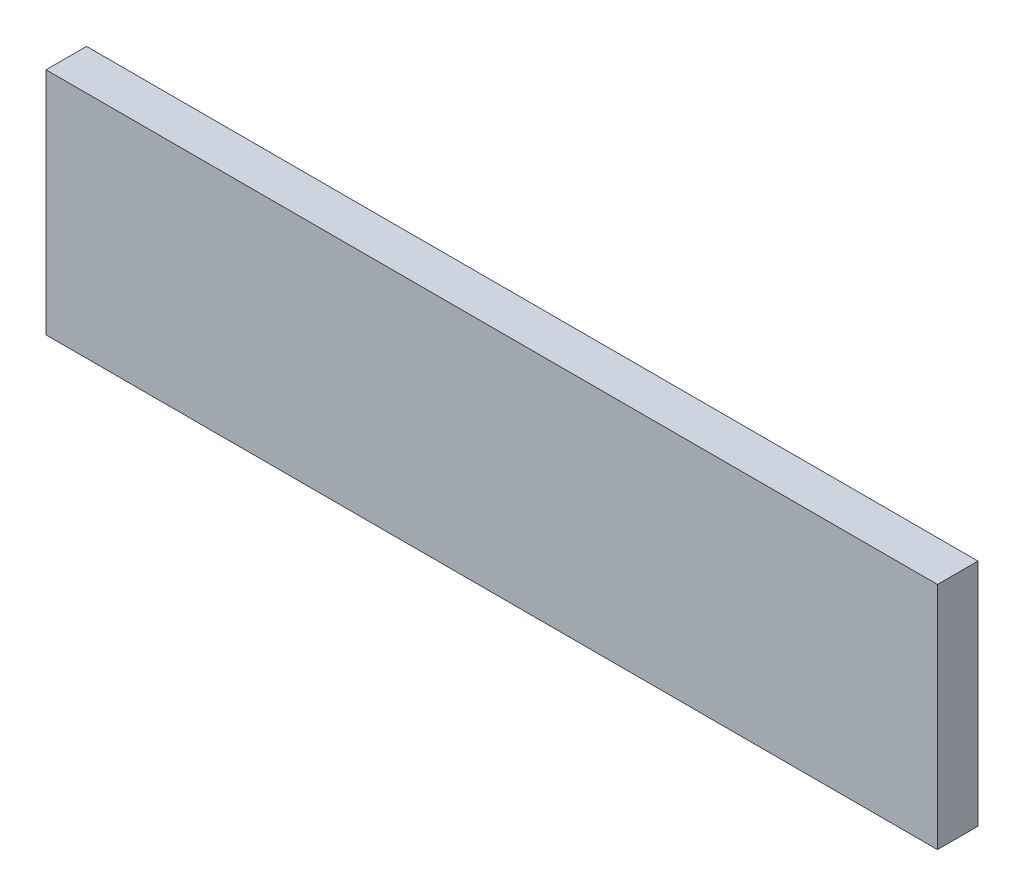
ISO-10303-21;
HEADER;
FILE_DESCRIPTION(('STEP AP214'),'2;1');
FILE_NAME('part.step','',(''),(''),'','','');
FILE_SCHEMA(('AUTOMOTIVE_DESIGN { 1 0 10303 214 1 1 1 1 }'));
ENDSEC;
DATA;
#1=APPLICATION_CONTEXT('core data for automotive mechanical design processes');
#2=APPLICATION_PROTOCOL_DEFINITION('international standard','automotive_design',2000,#1);
#3=PRODUCT_CONTEXT('',#1,'mechanical');
#4=PRODUCT('Part','Part','',(#3));
#5=PRODUCT_RELATED_PRODUCT_CATEGORY('part','',(#4));
#6=PRODUCT_DEFINITION_FORMATION('','',#4);
#7=PRODUCT_DEFINITION_CONTEXT('part definition',#1,'design');
#8=PRODUCT_DEFINITION('design','',#6,#7);
#9=PRODUCT_DEFINITION_SHAPE('','',#8);
#10=(LENGTH_UNIT() NAMED_UNIT(*) SI_UNIT(.MILLI.,.METRE.));
#11=(NAMED_UNIT(*) PLANE_ANGLE_UNIT() SI_UNIT($,.RADIAN.));
#12=(NAMED_UNIT(*) SI_UNIT($,.STERADIAN.) SOLID_ANGLE_UNIT());
#13=UNCERTAINTY_MEASURE_WITH_UNIT(LENGTH_MEASURE(1.E-05),#10,'distance_accuracy_value','');
#14=(GEOMETRIC_REPRESENTATION_CONTEXT(3) GLOBAL_UNCERTAINTY_ASSIGNED_CONTEXT((#13)) GLOBAL_UNIT_ASSIGNED_CONTEXT((#10,
#11,#12)) REPRESENTATION_CONTEXT('',''));
#15=CARTESIAN_POINT('',(0.,0.,0.));
#16=DIRECTION('',(0.,0.,1.));
#17=DIRECTION('',(1.,0.,0.));
#18=AXIS2_PLACEMENT_3D('',#15,#16,#17);
#19=CARTESIAN_POINT('',(165.,42.5,15.));
#20=DIRECTION('',(-1.,0.,0.));
#21=DIRECTION('',(0.,-1.,0.));
#22=AXIS2_PLACEMENT_3D('',#19,#20,#21);
#23=PLANE('',#22);
#24=DIRECTION('',(0.,1.,0.));
#25=VECTOR('',#24,1.);
#26=CARTESIAN_POINT('',(165.,42.5,0.));
#27=LINE('',#26,#25);
#28=CARTESIAN_POINT('',(165.,-42.5,0.));
#29=VERTEX_POINT('',#28);
#30=CARTESIAN_POINT('',(165.,42.5,0.));
#31=VERTEX_POINT('',#30);
#32=EDGE_CURVE('E99',#29,#31,#27,.T.);
#33=ORIENTED_EDGE('',*,*,#32,.T.);
#34=DIRECTION('',(0.,0.,-1.));
#35=VECTOR('',#34,1.);
#36=CARTESIAN_POINT('',(165.,42.5,15.));
#37=LINE('',#36,#35);
#38=CARTESIAN_POINT('',(165.,42.5,15.));
#39=VERTEX_POINT('',#38);
#40=EDGE_CURVE('E11',#39,#31,#37,.T.);
#41=ORIENTED_EDGE('',*,*,#40,.F.);
#42=DIRECTION('',(0.,1.,0.));
#43=VECTOR('',#42,1.);
#44=CARTESIAN_POINT('',(165.,42.5,15.));
#45=LINE('',#44,#43);
#46=CARTESIAN_POINT('',(165.,-42.5,15.));
#47=VERTEX_POINT('',#46);
#48=EDGE_CURVE('E87',#47,#39,#45,.T.);
#49=ORIENTED_EDGE('',*,*,#48,.F.);
#50=DIRECTION('',(0.,0.,-1.));
#51=VECTOR('',#50,1.);
#52=CARTESIAN_POINT('',(165.,-42.5,15.));
#53=LINE('',#52,#51);
#54=EDGE_CURVE('E95',#47,#29,#53,.T.);
#55=ORIENTED_EDGE('',*,*,#54,.T.);
#56=EDGE_LOOP('',(#33,#41,#49,#55));
#57=FACE_BOUND('',#56,.T.);
#58=ADVANCED_FACE('F36',(#57),#23,.F.);
#59=CARTESIAN_POINT('',(-165.,42.5,15.));
#60=DIRECTION('',(0.,-1.,0.));
#61=DIRECTION('',(0.,0.,-1.));
#62=AXIS2_PLACEMENT_3D('',#59,#60,#61);
#63=PLANE('',#62);
#64=DIRECTION('',(-1.,0.,0.));
#65=VECTOR('',#64,1.);
#66=CARTESIAN_POINT('',(-165.,42.5,0.));
#67=LINE('',#66,#65);
#68=CARTESIAN_POINT('',(-165.,42.5,0.));
#69=VERTEX_POINT('',#68);
#70=EDGE_CURVE('E91',#31,#69,#67,.T.);
#71=ORIENTED_EDGE('',*,*,#70,.T.);
#72=DIRECTION('',(0.,0.,-1.));
#73=VECTOR('',#72,1.);
#74=CARTESIAN_POINT('',(-165.,42.5,15.));
#75=LINE('',#74,#73);
#76=CARTESIAN_POINT('',(-165.,42.5,15.));
#77=VERTEX_POINT('',#76);
#78=EDGE_CURVE('E44',#77,#69,#75,.T.);
#79=ORIENTED_EDGE('',*,*,#78,.F.);
#80=DIRECTION('',(-1.,0.,0.));
#81=VECTOR('',#80,1.);
#82=CARTESIAN_POINT('',(-165.,42.5,15.));
#83=LINE('',#82,#81);
#84=EDGE_CURVE('E82',#39,#77,#83,.T.);
#85=ORIENTED_EDGE('',*,*,#84,.F.);
#86=ORIENTED_EDGE('',*,*,#40,.T.);
#87=EDGE_LOOP('',(#71,#79,#85,#86));
#88=FACE_BOUND('',#87,.T.);
#89=ADVANCED_FACE('F90',(#88),#63,.F.);
#90=CARTESIAN_POINT('',(-165.,42.5,15.));
#91=DIRECTION('',(1.,0.,0.));
#92=DIRECTION('',(0.,1.,0.));
#93=AXIS2_PLACEMENT_3D('',#90,#91,#92);
#94=PLANE('',#93);
#95=DIRECTION('',(0.,-1.,0.));
#96=VECTOR('',#95,1.);
#97=CARTESIAN_POINT('',(-165.,42.5,0.));
#98=LINE('',#97,#96);
#99=CARTESIAN_POINT('',(-165.,-42.5,0.));
#100=VERTEX_POINT('',#99);
#101=EDGE_CURVE('E69',#69,#100,#98,.T.);
#102=ORIENTED_EDGE('',*,*,#101,.T.);
#103=DIRECTION('',(0.,0.,-1.));
#104=VECTOR('',#103,1.);
#105=CARTESIAN_POINT('',(-165.,-42.5,15.));
#106=LINE('',#105,#104);
#107=CARTESIAN_POINT('',(-165.,-42.5,15.));
#108=VERTEX_POINT('',#107);
#109=EDGE_CURVE('E92',#108,#100,#106,.T.);
#110=ORIENTED_EDGE('',*,*,#109,.F.);
#111=DIRECTION('',(0.,-1.,0.));
#112=VECTOR('',#111,1.);
#113=CARTESIAN_POINT('',(-165.,42.5,15.));
#114=LINE('',#113,#112);
#115=EDGE_CURVE('E85',#77,#108,#114,.T.);
#116=ORIENTED_EDGE('',*,*,#115,.F.);
#117=ORIENTED_EDGE('',*,*,#78,.T.);
#118=EDGE_LOOP('',(#102,#110,#116,#117));
#119=FACE_BOUND('',#118,.T.);
#120=ADVANCED_FACE('F93',(#119),#94,.F.);
#121=CARTESIAN_POINT('',(-165.,-42.5,15.));
#122=DIRECTION('',(0.,1.,0.));
#123=DIRECTION('',(0.,0.,1.));
#124=AXIS2_PLACEMENT_3D('',#121,#122,#123);
#125=PLANE('',#124);
#126=DIRECTION('',(1.,0.,0.));
#127=VECTOR('',#126,1.);
#128=CARTESIAN_POINT('',(-165.,-42.5,0.));
#129=LINE('',#128,#127);
#130=EDGE_CURVE('E75',#100,#29,#129,.T.);
#131=ORIENTED_EDGE('',*,*,#130,.T.);
#132=ORIENTED_EDGE('',*,*,#54,.F.);
#133=DIRECTION('',(1.,0.,0.));
#134=VECTOR('',#133,1.);
#135=CARTESIAN_POINT('',(-165.,-42.5,15.));
#136=LINE('',#135,#134);
#137=EDGE_CURVE('E52',#108,#47,#136,.T.);
#138=ORIENTED_EDGE('',*,*,#137,.F.);
#139=ORIENTED_EDGE('',*,*,#109,.T.);
#140=EDGE_LOOP('',(#131,#132,#138,#139));
#141=FACE_BOUND('',#140,.T.);
#142=ADVANCED_FACE('F106',(#141),#125,.F.);
#143=CARTESIAN_POINT('',(0.,0.,15.));
#144=DIRECTION('',(0.,0.,1.));
#145=DIRECTION('',(1.,0.,0.));
#146=AXIS2_PLACEMENT_3D('',#143,#144,#145);
#147=PLANE('',#146);
#148=ORIENTED_EDGE('',*,*,#48,.T.);
#149=ORIENTED_EDGE('',*,*,#84,.T.);
#150=ORIENTED_EDGE('',*,*,#115,.T.);
#151=ORIENTED_EDGE('',*,*,#137,.T.);
#152=EDGE_LOOP('',(#148,#149,#150,#151));
#153=FACE_BOUND('',#152,.T.);
#154=ADVANCED_FACE('F83',(#153),#147,.T.);
#155=CARTESIAN_POINT('',(0.,0.,0.));
#156=DIRECTION('',(0.,0.,1.));
#157=DIRECTION('',(1.,0.,0.));
#158=AXIS2_PLACEMENT_3D('',#155,#156,#157);
#159=PLANE('',#158);
#160=ORIENTED_EDGE('',*,*,#32,.F.);
#161=ORIENTED_EDGE('',*,*,#130,.F.);
#162=ORIENTED_EDGE('',*,*,#101,.F.);
#163=ORIENTED_EDGE('',*,*,#70,.F.);
#164=EDGE_LOOP('',(#160,#161,#162,#163));
#165=FACE_BOUND('',#164,.T.);
#166=ADVANCED_FACE('F109',(#165),#159,.F.);
#167=CLOSED_SHELL('',(#58,#89,#120,#142,#154,#166));
#168=MANIFOLD_SOLID_BREP('B2',#167);
#169=ADVANCED_BREP_SHAPE_REPRESENTATION('',(#18,#168),#14);
#170=SHAPE_DEFINITION_REPRESENTATION(#9,#169);
ENDSEC;
END-ISO-10303-21;
